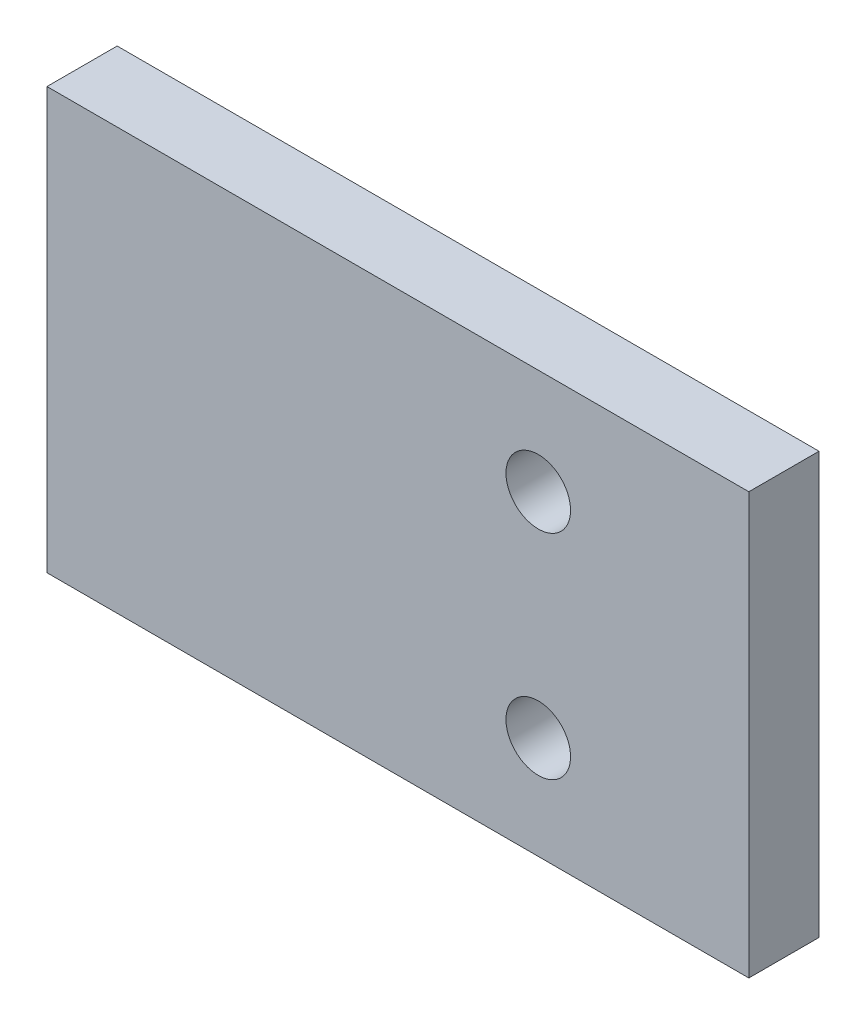
ISO-10303-21;
HEADER;
FILE_DESCRIPTION(('STEP AP214'),'2;1');
FILE_NAME('part.step','',(''),(''),'','','');
FILE_SCHEMA(('AUTOMOTIVE_DESIGN { 1 0 10303 214 1 1 1 1 }'));
ENDSEC;
DATA;
#1=APPLICATION_CONTEXT('core data for automotive mechanical design processes');
#2=APPLICATION_PROTOCOL_DEFINITION('international standard','automotive_design',2000,#1);
#3=PRODUCT_CONTEXT('',#1,'mechanical');
#4=PRODUCT('Part','Part','',(#3));
#5=PRODUCT_RELATED_PRODUCT_CATEGORY('part','',(#4));
#6=PRODUCT_DEFINITION_FORMATION('','',#4);
#7=PRODUCT_DEFINITION_CONTEXT('part definition',#1,'design');
#8=PRODUCT_DEFINITION('design','',#6,#7);
#9=PRODUCT_DEFINITION_SHAPE('','',#8);
#10=(LENGTH_UNIT() NAMED_UNIT(*) SI_UNIT(.MILLI.,.METRE.));
#11=(NAMED_UNIT(*) PLANE_ANGLE_UNIT() SI_UNIT($,.RADIAN.));
#12=(NAMED_UNIT(*) SI_UNIT($,.STERADIAN.) SOLID_ANGLE_UNIT());
#13=UNCERTAINTY_MEASURE_WITH_UNIT(LENGTH_MEASURE(1.E-05),#10,'distance_accuracy_value','');
#14=(GEOMETRIC_REPRESENTATION_CONTEXT(3) GLOBAL_UNCERTAINTY_ASSIGNED_CONTEXT((#13)) GLOBAL_UNIT_ASSIGNED_CONTEXT((#10,
#11,#12)) REPRESENTATION_CONTEXT('',''));
#15=CARTESIAN_POINT('',(0.,0.,0.));
#16=DIRECTION('',(0.,0.,1.));
#17=DIRECTION('',(1.,0.,0.));
#18=AXIS2_PLACEMENT_3D('',#15,#16,#17);
#19=CARTESIAN_POINT('',(-215.9,0.,3.175));
#20=DIRECTION('',(-1.,0.,0.));
#21=DIRECTION('',(0.,0.,1.));
#22=AXIS2_PLACEMENT_3D('',#19,#20,#21);
#23=PLANE('',#22);
#24=DIRECTION('',(0.,1.,0.));
#25=VECTOR('',#24,1.);
#26=CARTESIAN_POINT('',(-215.9,0.,0.));
#27=LINE('',#26,#25);
#28=CARTESIAN_POINT('',(-215.9,0.,0.));
#29=VERTEX_POINT('',#28);
#30=CARTESIAN_POINT('',(-215.9,19.05,0.));
#31=VERTEX_POINT('',#30);
#32=EDGE_CURVE('E105',#29,#31,#27,.T.);
#33=ORIENTED_EDGE('',*,*,#32,.F.);
#34=DIRECTION('',(0.,0.,-1.));
#35=VECTOR('',#34,1.);
#36=CARTESIAN_POINT('',(-215.9,0.,3.175));
#37=LINE('',#36,#35);
#38=CARTESIAN_POINT('',(-215.9,0.,3.175));
#39=VERTEX_POINT('',#38);
#40=EDGE_CURVE('E11',#39,#29,#37,.T.);
#41=ORIENTED_EDGE('',*,*,#40,.F.);
#42=DIRECTION('',(0.,1.,0.));
#43=VECTOR('',#42,1.);
#44=CARTESIAN_POINT('',(-215.9,0.,3.175));
#45=LINE('',#44,#43);
#46=CARTESIAN_POINT('',(-215.9,19.05,3.175));
#47=VERTEX_POINT('',#46);
#48=EDGE_CURVE('E99',#39,#47,#45,.T.);
#49=ORIENTED_EDGE('',*,*,#48,.T.);
#50=DIRECTION('',(0.,0.,-1.));
#51=VECTOR('',#50,1.);
#52=CARTESIAN_POINT('',(-215.9,19.05,3.175));
#53=LINE('',#52,#51);
#54=EDGE_CURVE('E42',#47,#31,#53,.T.);
#55=ORIENTED_EDGE('',*,*,#54,.T.);
#56=EDGE_LOOP('',(#33,#41,#49,#55));
#57=FACE_BOUND('',#56,.T.);
#58=ADVANCED_FACE('F39',(#57),#23,.T.);
#59=CARTESIAN_POINT('',(-215.9,0.,3.175));
#60=DIRECTION('',(0.,1.,0.));
#61=DIRECTION('',(0.,0.,1.));
#62=AXIS2_PLACEMENT_3D('',#59,#60,#61);
#63=PLANE('',#62);
#64=DIRECTION('',(1.,0.,0.));
#65=VECTOR('',#64,1.);
#66=CARTESIAN_POINT('',(-215.9,0.,0.));
#67=LINE('',#66,#65);
#68=CARTESIAN_POINT('',(-184.15,0.,0.));
#69=VERTEX_POINT('',#68);
#70=EDGE_CURVE('E72',#29,#69,#67,.T.);
#71=ORIENTED_EDGE('',*,*,#70,.T.);
#72=DIRECTION('',(0.,0.,-1.));
#73=VECTOR('',#72,1.);
#74=CARTESIAN_POINT('',(-184.15,0.,3.175));
#75=LINE('',#74,#73);
#76=CARTESIAN_POINT('',(-184.15,0.,3.175));
#77=VERTEX_POINT('',#76);
#78=EDGE_CURVE('E48',#77,#69,#75,.T.);
#79=ORIENTED_EDGE('',*,*,#78,.F.);
#80=DIRECTION('',(1.,0.,0.));
#81=VECTOR('',#80,1.);
#82=CARTESIAN_POINT('',(-215.9,0.,3.175));
#83=LINE('',#82,#81);
#84=EDGE_CURVE('E89',#39,#77,#83,.T.);
#85=ORIENTED_EDGE('',*,*,#84,.F.);
#86=ORIENTED_EDGE('',*,*,#40,.T.);
#87=EDGE_LOOP('',(#71,#79,#85,#86));
#88=FACE_BOUND('',#87,.T.);
#89=ADVANCED_FACE('F116',(#88),#63,.F.);
#90=CARTESIAN_POINT('',(-184.15,0.,3.175));
#91=DIRECTION('',(-1.,0.,0.));
#92=DIRECTION('',(0.,0.,1.));
#93=AXIS2_PLACEMENT_3D('',#90,#91,#92);
#94=PLANE('',#93);
#95=DIRECTION('',(0.,1.,0.));
#96=VECTOR('',#95,1.);
#97=CARTESIAN_POINT('',(-184.15,0.,0.));
#98=LINE('',#97,#96);
#99=CARTESIAN_POINT('',(-184.15,19.05,0.));
#100=VERTEX_POINT('',#99);
#101=EDGE_CURVE('E96',#69,#100,#98,.T.);
#102=ORIENTED_EDGE('',*,*,#101,.T.);
#103=DIRECTION('',(0.,0.,-1.));
#104=VECTOR('',#103,1.);
#105=CARTESIAN_POINT('',(-184.15,19.05,3.175));
#106=LINE('',#105,#104);
#107=CARTESIAN_POINT('',(-184.15,19.05,3.175));
#108=VERTEX_POINT('',#107);
#109=EDGE_CURVE('E93',#108,#100,#106,.T.);
#110=ORIENTED_EDGE('',*,*,#109,.F.);
#111=DIRECTION('',(0.,1.,0.));
#112=VECTOR('',#111,1.);
#113=CARTESIAN_POINT('',(-184.15,0.,3.175));
#114=LINE('',#113,#112);
#115=EDGE_CURVE('E84',#77,#108,#114,.T.);
#116=ORIENTED_EDGE('',*,*,#115,.F.);
#117=ORIENTED_EDGE('',*,*,#78,.T.);
#118=EDGE_LOOP('',(#102,#110,#116,#117));
#119=FACE_BOUND('',#118,.T.);
#120=ADVANCED_FACE('F94',(#119),#94,.F.);
#121=CARTESIAN_POINT('',(-215.9,19.05,3.175));
#122=DIRECTION('',(0.,1.,0.));
#123=DIRECTION('',(0.,0.,1.));
#124=AXIS2_PLACEMENT_3D('',#121,#122,#123);
#125=PLANE('',#124);
#126=DIRECTION('',(1.,0.,0.));
#127=VECTOR('',#126,1.);
#128=CARTESIAN_POINT('',(-215.9,19.05,0.));
#129=LINE('',#128,#127);
#130=EDGE_CURVE('E108',#31,#100,#129,.T.);
#131=ORIENTED_EDGE('',*,*,#130,.F.);
#132=ORIENTED_EDGE('',*,*,#54,.F.);
#133=DIRECTION('',(1.,0.,0.));
#134=VECTOR('',#133,1.);
#135=CARTESIAN_POINT('',(-215.9,19.05,3.175));
#136=LINE('',#135,#134);
#137=EDGE_CURVE('E88',#47,#108,#136,.T.);
#138=ORIENTED_EDGE('',*,*,#137,.T.);
#139=ORIENTED_EDGE('',*,*,#109,.T.);
#140=EDGE_LOOP('',(#131,#132,#138,#139));
#141=FACE_BOUND('',#140,.T.);
#142=ADVANCED_FACE('F98',(#141),#125,.T.);
#143=CARTESIAN_POINT('',(0.,0.,3.175));
#144=DIRECTION('',(0.,0.,-1.));
#145=DIRECTION('',(-1.,0.,0.));
#146=AXIS2_PLACEMENT_3D('',#143,#144,#145);
#147=PLANE('',#146);
#148=CARTESIAN_POINT('',(-193.675,14.2875,3.175));
#149=DIRECTION('',(0.,0.,-1.));
#150=DIRECTION('',(-1.,0.,0.));
#151=AXIS2_PLACEMENT_3D('',#148,#149,#150);
#152=CIRCLE('',#151,1.4605);
#153=CARTESIAN_POINT('',(-195.1355,14.2875,3.175));
#154=VERTEX_POINT('',#153);
#155=EDGE_CURVE('E109',#154,#154,#152,.T.);
#156=ORIENTED_EDGE('',*,*,#155,.T.);
#157=EDGE_LOOP('',(#156));
#158=FACE_BOUND('',#157,.T.);
#159=CARTESIAN_POINT('',(-193.675,4.6355,3.175));
#160=DIRECTION('',(0.,0.,-1.));
#161=DIRECTION('',(-1.,0.,0.));
#162=AXIS2_PLACEMENT_3D('',#159,#160,#161);
#163=CIRCLE('',#162,1.4605);
#164=CARTESIAN_POINT('',(-195.1355,4.6355,3.175));
#165=VERTEX_POINT('',#164);
#166=EDGE_CURVE('E153',#165,#165,#163,.T.);
#167=ORIENTED_EDGE('',*,*,#166,.T.);
#168=EDGE_LOOP('',(#167));
#169=FACE_BOUND('',#168,.T.);
#170=ORIENTED_EDGE('',*,*,#48,.F.);
#171=ORIENTED_EDGE('',*,*,#84,.T.);
#172=ORIENTED_EDGE('',*,*,#115,.T.);
#173=ORIENTED_EDGE('',*,*,#137,.F.);
#174=EDGE_LOOP('',(#170,#171,#172,#173));
#175=FACE_BOUND('',#174,.T.);
#176=ADVANCED_FACE('F87',(#158,#169,#175),#147,.F.);
#177=CARTESIAN_POINT('',(0.,0.,0.));
#178=DIRECTION('',(0.,0.,-1.));
#179=DIRECTION('',(-1.,0.,0.));
#180=AXIS2_PLACEMENT_3D('',#177,#178,#179);
#181=PLANE('',#180);
#182=CARTESIAN_POINT('',(-193.675,14.2875,0.));
#183=DIRECTION('',(0.,0.,-1.));
#184=DIRECTION('',(-1.,0.,0.));
#185=AXIS2_PLACEMENT_3D('',#182,#183,#184);
#186=CIRCLE('',#185,1.4605);
#187=CARTESIAN_POINT('',(-195.1355,14.2875,0.));
#188=VERTEX_POINT('',#187);
#189=EDGE_CURVE('E151',#188,#188,#186,.T.);
#190=ORIENTED_EDGE('',*,*,#189,.F.);
#191=EDGE_LOOP('',(#190));
#192=FACE_BOUND('',#191,.T.);
#193=CARTESIAN_POINT('',(-193.675,4.6355,0.));
#194=DIRECTION('',(0.,0.,-1.));
#195=DIRECTION('',(-1.,0.,0.));
#196=AXIS2_PLACEMENT_3D('',#193,#194,#195);
#197=CIRCLE('',#196,1.4605);
#198=CARTESIAN_POINT('',(-195.1355,4.6355,0.));
#199=VERTEX_POINT('',#198);
#200=EDGE_CURVE('E157',#199,#199,#197,.T.);
#201=ORIENTED_EDGE('',*,*,#200,.F.);
#202=EDGE_LOOP('',(#201));
#203=FACE_BOUND('',#202,.T.);
#204=ORIENTED_EDGE('',*,*,#32,.T.);
#205=ORIENTED_EDGE('',*,*,#130,.T.);
#206=ORIENTED_EDGE('',*,*,#101,.F.);
#207=ORIENTED_EDGE('',*,*,#70,.F.);
#208=EDGE_LOOP('',(#204,#205,#206,#207));
#209=FACE_BOUND('',#208,.T.);
#210=ADVANCED_FACE('F114',(#192,#203,#209),#181,.T.);
#211=CARTESIAN_POINT('',(-193.675,4.6355,9.525));
#212=DIRECTION('',(0.,0.,-1.));
#213=DIRECTION('',(-1.,0.,0.));
#214=AXIS2_PLACEMENT_3D('',#211,#212,#213);
#215=CYLINDRICAL_SURFACE('',#214,1.4605);
#216=ORIENTED_EDGE('',*,*,#200,.T.);
#217=EDGE_LOOP('',(#216));
#218=FACE_BOUND('',#217,.T.);
#219=ORIENTED_EDGE('',*,*,#166,.F.);
#220=EDGE_LOOP('',(#219));
#221=FACE_BOUND('',#220,.T.);
#222=ADVANCED_FACE('F135',(#218,#221),#215,.F.);
#223=CARTESIAN_POINT('',(-193.675,14.2875,9.525));
#224=DIRECTION('',(0.,0.,-1.));
#225=DIRECTION('',(-1.,0.,0.));
#226=AXIS2_PLACEMENT_3D('',#223,#224,#225);
#227=CYLINDRICAL_SURFACE('',#226,1.4605);
#228=ORIENTED_EDGE('',*,*,#189,.T.);
#229=EDGE_LOOP('',(#228));
#230=FACE_BOUND('',#229,.T.);
#231=ORIENTED_EDGE('',*,*,#155,.F.);
#232=EDGE_LOOP('',(#231));
#233=FACE_BOUND('',#232,.T.);
#234=ADVANCED_FACE('F142',(#230,#233),#227,.F.);
#235=CLOSED_SHELL('',(#58,#89,#120,#142,#176,#210,#222,#234));
#236=MANIFOLD_SOLID_BREP('B2',#235);
#237=ADVANCED_BREP_SHAPE_REPRESENTATION('',(#18,#236),#14);
#238=SHAPE_DEFINITION_REPRESENTATION(#9,#237);
ENDSEC;
END-ISO-10303-21;
